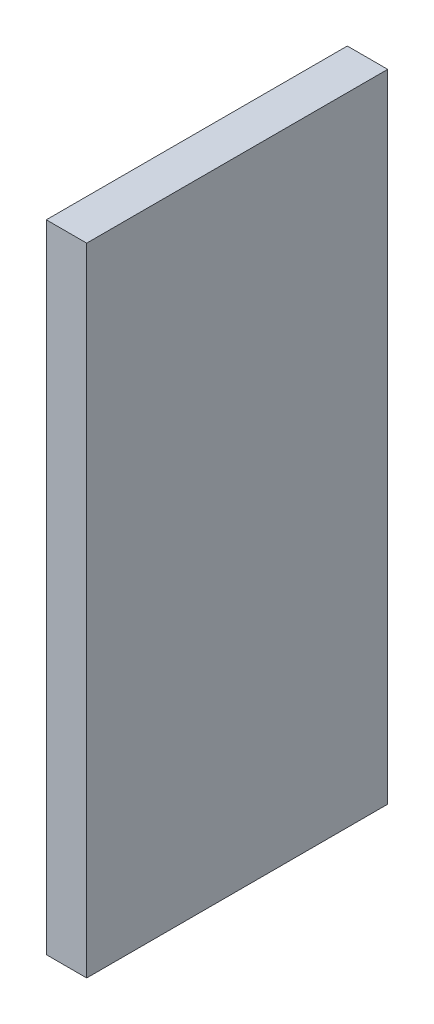
ISO-10303-21;
HEADER;
FILE_DESCRIPTION(('STEP AP214'),'2;1');
FILE_NAME('part.step','',(''),(''),'','','');
FILE_SCHEMA(('AUTOMOTIVE_DESIGN { 1 0 10303 214 1 1 1 1 }'));
ENDSEC;
DATA;
#1=APPLICATION_CONTEXT('core data for automotive mechanical design processes');
#2=APPLICATION_PROTOCOL_DEFINITION('international standard','automotive_design',2000,#1);
#3=PRODUCT_CONTEXT('',#1,'mechanical');
#4=PRODUCT('Part','Part','',(#3));
#5=PRODUCT_RELATED_PRODUCT_CATEGORY('part','',(#4));
#6=PRODUCT_DEFINITION_FORMATION('','',#4);
#7=PRODUCT_DEFINITION_CONTEXT('part definition',#1,'design');
#8=PRODUCT_DEFINITION('design','',#6,#7);
#9=PRODUCT_DEFINITION_SHAPE('','',#8);
#10=(LENGTH_UNIT() NAMED_UNIT(*) SI_UNIT(.MILLI.,.METRE.));
#11=(NAMED_UNIT(*) PLANE_ANGLE_UNIT() SI_UNIT($,.RADIAN.));
#12=(NAMED_UNIT(*) SI_UNIT($,.STERADIAN.) SOLID_ANGLE_UNIT());
#13=UNCERTAINTY_MEASURE_WITH_UNIT(LENGTH_MEASURE(1.E-05),#10,'distance_accuracy_value','');
#14=(GEOMETRIC_REPRESENTATION_CONTEXT(3) GLOBAL_UNCERTAINTY_ASSIGNED_CONTEXT((#13)) GLOBAL_UNIT_ASSIGNED_CONTEXT((#10,
#11,#12)) REPRESENTATION_CONTEXT('',''));
#15=CARTESIAN_POINT('',(0.,0.,0.));
#16=DIRECTION('',(0.,0.,1.));
#17=DIRECTION('',(1.,0.,0.));
#18=AXIS2_PLACEMENT_3D('',#15,#16,#17);
#19=CARTESIAN_POINT('',(6.35,0.,0.));
#20=DIRECTION('',(0.,0.,-1.));
#21=DIRECTION('',(-1.,0.,0.));
#22=AXIS2_PLACEMENT_3D('',#19,#20,#21);
#23=PLANE('',#22);
#24=DIRECTION('',(0.,-1.,0.));
#25=VECTOR('',#24,1.);
#26=CARTESIAN_POINT('',(0.,0.,0.));
#27=LINE('',#26,#25);
#28=CARTESIAN_POINT('',(0.,100.,0.));
#29=VERTEX_POINT('',#28);
#30=CARTESIAN_POINT('',(0.,0.,0.));
#31=VERTEX_POINT('',#30);
#32=EDGE_CURVE('E107',#29,#31,#27,.T.);
#33=ORIENTED_EDGE('',*,*,#32,.T.);
#34=DIRECTION('',(-1.,0.,0.));
#35=VECTOR('',#34,1.);
#36=CARTESIAN_POINT('',(6.35,0.,0.));
#37=LINE('',#36,#35);
#38=CARTESIAN_POINT('',(6.35,0.,0.));
#39=VERTEX_POINT('',#38);
#40=EDGE_CURVE('E11',#39,#31,#37,.T.);
#41=ORIENTED_EDGE('',*,*,#40,.F.);
#42=DIRECTION('',(0.,-1.,0.));
#43=VECTOR('',#42,1.);
#44=CARTESIAN_POINT('',(6.35,0.,0.));
#45=LINE('',#44,#43);
#46=CARTESIAN_POINT('',(6.35,100.,0.));
#47=VERTEX_POINT('',#46);
#48=EDGE_CURVE('E91',#47,#39,#45,.T.);
#49=ORIENTED_EDGE('',*,*,#48,.F.);
#50=DIRECTION('',(-1.,0.,0.));
#51=VECTOR('',#50,1.);
#52=CARTESIAN_POINT('',(6.35,100.,0.));
#53=LINE('',#52,#51);
#54=EDGE_CURVE('E103',#47,#29,#53,.T.);
#55=ORIENTED_EDGE('',*,*,#54,.T.);
#56=EDGE_LOOP('',(#33,#41,#49,#55));
#57=FACE_BOUND('',#56,.T.);
#58=ADVANCED_FACE('F39',(#57),#23,.F.);
#59=CARTESIAN_POINT('',(6.35,0.,0.));
#60=DIRECTION('',(0.,1.,0.));
#61=DIRECTION('',(0.,0.,1.));
#62=AXIS2_PLACEMENT_3D('',#59,#60,#61);
#63=PLANE('',#62);
#64=DIRECTION('',(0.,0.,-1.));
#65=VECTOR('',#64,1.);
#66=CARTESIAN_POINT('',(0.,0.,0.));
#67=LINE('',#66,#65);
#68=CARTESIAN_POINT('',(0.,0.,-47.3));
#69=VERTEX_POINT('',#68);
#70=EDGE_CURVE('E96',#31,#69,#67,.T.);
#71=ORIENTED_EDGE('',*,*,#70,.T.);
#72=DIRECTION('',(-1.,0.,0.));
#73=VECTOR('',#72,1.);
#74=CARTESIAN_POINT('',(6.35,0.,-47.3));
#75=LINE('',#74,#73);
#76=CARTESIAN_POINT('',(6.35,0.,-47.3));
#77=VERTEX_POINT('',#76);
#78=EDGE_CURVE('E48',#77,#69,#75,.T.);
#79=ORIENTED_EDGE('',*,*,#78,.F.);
#80=DIRECTION('',(0.,0.,-1.));
#81=VECTOR('',#80,1.);
#82=CARTESIAN_POINT('',(6.35,0.,0.));
#83=LINE('',#82,#81);
#84=EDGE_CURVE('E86',#39,#77,#83,.T.);
#85=ORIENTED_EDGE('',*,*,#84,.F.);
#86=ORIENTED_EDGE('',*,*,#40,.T.);
#87=EDGE_LOOP('',(#71,#79,#85,#86));
#88=FACE_BOUND('',#87,.T.);
#89=ADVANCED_FACE('F95',(#88),#63,.F.);
#90=CARTESIAN_POINT('',(6.35,0.,-47.3));
#91=DIRECTION('',(0.,0.,1.));
#92=DIRECTION('',(1.,0.,0.));
#93=AXIS2_PLACEMENT_3D('',#90,#91,#92);
#94=PLANE('',#93);
#95=DIRECTION('',(0.,1.,0.));
#96=VECTOR('',#95,1.);
#97=CARTESIAN_POINT('',(0.,0.,-47.3));
#98=LINE('',#97,#96);
#99=CARTESIAN_POINT('',(0.,100.,-47.3));
#100=VERTEX_POINT('',#99);
#101=EDGE_CURVE('E73',#69,#100,#98,.T.);
#102=ORIENTED_EDGE('',*,*,#101,.T.);
#103=DIRECTION('',(-1.,0.,0.));
#104=VECTOR('',#103,1.);
#105=CARTESIAN_POINT('',(6.35,100.,-47.3));
#106=LINE('',#105,#104);
#107=CARTESIAN_POINT('',(6.35,100.,-47.3));
#108=VERTEX_POINT('',#107);
#109=EDGE_CURVE('E98',#108,#100,#106,.T.);
#110=ORIENTED_EDGE('',*,*,#109,.F.);
#111=DIRECTION('',(0.,1.,0.));
#112=VECTOR('',#111,1.);
#113=CARTESIAN_POINT('',(6.35,0.,-47.3));
#114=LINE('',#113,#112);
#115=EDGE_CURVE('E89',#77,#108,#114,.T.);
#116=ORIENTED_EDGE('',*,*,#115,.F.);
#117=ORIENTED_EDGE('',*,*,#78,.T.);
#118=EDGE_LOOP('',(#102,#110,#116,#117));
#119=FACE_BOUND('',#118,.T.);
#120=ADVANCED_FACE('F99',(#119),#94,.F.);
#121=CARTESIAN_POINT('',(6.35,100.,0.));
#122=DIRECTION('',(0.,-1.,0.));
#123=DIRECTION('',(0.,0.,-1.));
#124=AXIS2_PLACEMENT_3D('',#121,#122,#123);
#125=PLANE('',#124);
#126=DIRECTION('',(0.,0.,1.));
#127=VECTOR('',#126,1.);
#128=CARTESIAN_POINT('',(0.,100.,0.));
#129=LINE('',#128,#127);
#130=EDGE_CURVE('E79',#100,#29,#129,.T.);
#131=ORIENTED_EDGE('',*,*,#130,.T.);
#132=ORIENTED_EDGE('',*,*,#54,.F.);
#133=DIRECTION('',(0.,0.,1.));
#134=VECTOR('',#133,1.);
#135=CARTESIAN_POINT('',(6.35,100.,0.));
#136=LINE('',#135,#134);
#137=EDGE_CURVE('E56',#108,#47,#136,.T.);
#138=ORIENTED_EDGE('',*,*,#137,.F.);
#139=ORIENTED_EDGE('',*,*,#109,.T.);
#140=EDGE_LOOP('',(#131,#132,#138,#139));
#141=FACE_BOUND('',#140,.T.);
#142=ADVANCED_FACE('F120',(#141),#125,.F.);
#143=CARTESIAN_POINT('',(6.35,0.,0.));
#144=DIRECTION('',(-1.,0.,0.));
#145=DIRECTION('',(0.,0.,1.));
#146=AXIS2_PLACEMENT_3D('',#143,#144,#145);
#147=PLANE('',#146);
#148=ORIENTED_EDGE('',*,*,#48,.T.);
#149=ORIENTED_EDGE('',*,*,#84,.T.);
#150=ORIENTED_EDGE('',*,*,#115,.T.);
#151=ORIENTED_EDGE('',*,*,#137,.T.);
#152=EDGE_LOOP('',(#148,#149,#150,#151));
#153=FACE_BOUND('',#152,.T.);
#154=ADVANCED_FACE('F87',(#153),#147,.F.);
#155=CARTESIAN_POINT('',(0.,0.,0.));
#156=DIRECTION('',(-1.,0.,0.));
#157=DIRECTION('',(0.,0.,1.));
#158=AXIS2_PLACEMENT_3D('',#155,#156,#157);
#159=PLANE('',#158);
#160=ORIENTED_EDGE('',*,*,#32,.F.);
#161=ORIENTED_EDGE('',*,*,#130,.F.);
#162=ORIENTED_EDGE('',*,*,#101,.F.);
#163=ORIENTED_EDGE('',*,*,#70,.F.);
#164=EDGE_LOOP('',(#160,#161,#162,#163));
#165=FACE_BOUND('',#164,.T.);
#166=ADVANCED_FACE('F123',(#165),#159,.T.);
#167=CLOSED_SHELL('',(#58,#89,#120,#142,#154,#166));
#168=MANIFOLD_SOLID_BREP('B2',#167);
#169=ADVANCED_BREP_SHAPE_REPRESENTATION('',(#18,#168),#14);
#170=SHAPE_DEFINITION_REPRESENTATION(#9,#169);
ENDSEC;
END-ISO-10303-21;
